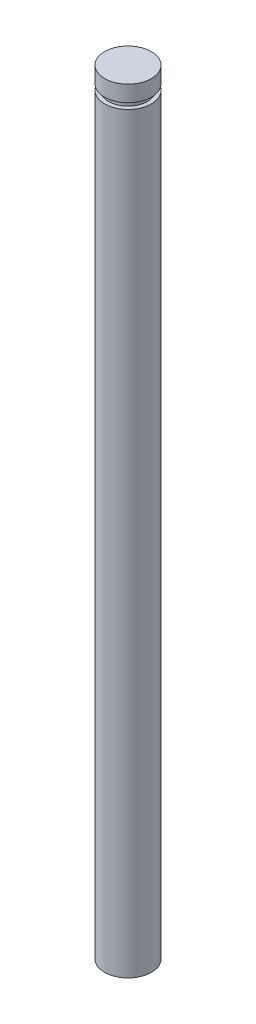
ISO-10303-21;
HEADER;
FILE_DESCRIPTION(('STEP AP214'),'2;1');
FILE_NAME('part.step','',(''),(''),'','','');
FILE_SCHEMA(('AUTOMOTIVE_DESIGN { 1 0 10303 214 1 1 1 1 }'));
ENDSEC;
DATA;
#1=APPLICATION_CONTEXT('core data for automotive mechanical design processes');
#2=APPLICATION_PROTOCOL_DEFINITION('international standard','automotive_design',2000,#1);
#3=PRODUCT_CONTEXT('',#1,'mechanical');
#4=PRODUCT('Part','Part','',(#3));
#5=PRODUCT_RELATED_PRODUCT_CATEGORY('part','',(#4));
#6=PRODUCT_DEFINITION_FORMATION('','',#4);
#7=PRODUCT_DEFINITION_CONTEXT('part definition',#1,'design');
#8=PRODUCT_DEFINITION('design','',#6,#7);
#9=PRODUCT_DEFINITION_SHAPE('','',#8);
#10=(LENGTH_UNIT() NAMED_UNIT(*) SI_UNIT(.MILLI.,.METRE.));
#11=(NAMED_UNIT(*) PLANE_ANGLE_UNIT() SI_UNIT($,.RADIAN.));
#12=(NAMED_UNIT(*) SI_UNIT($,.STERADIAN.) SOLID_ANGLE_UNIT());
#13=UNCERTAINTY_MEASURE_WITH_UNIT(LENGTH_MEASURE(1.E-05),#10,'distance_accuracy_value','');
#14=(GEOMETRIC_REPRESENTATION_CONTEXT(3) GLOBAL_UNCERTAINTY_ASSIGNED_CONTEXT((#13)) GLOBAL_UNIT_ASSIGNED_CONTEXT((#10,
#11,#12)) REPRESENTATION_CONTEXT('',''));
#15=CARTESIAN_POINT('',(0.,0.,0.));
#16=DIRECTION('',(0.,0.,1.));
#17=DIRECTION('',(1.,0.,0.));
#18=AXIS2_PLACEMENT_3D('',#15,#16,#17);
#19=CARTESIAN_POINT('',(0.,0.,0.));
#20=DIRECTION('',(0.,1.,0.));
#21=DIRECTION('',(-1.,0.,0.));
#22=AXIS2_PLACEMENT_3D('',#19,#20,#21);
#23=PLANE('',#22);
#24=CARTESIAN_POINT('',(0.,0.,0.));
#25=DIRECTION('',(0.,1.,0.));
#26=DIRECTION('',(-1.,0.,0.));
#27=AXIS2_PLACEMENT_3D('',#24,#25,#26);
#28=CIRCLE('',#27,0.725);
#29=CARTESIAN_POINT('',(-0.725,0.,0.));
#30=VERTEX_POINT('',#29);
#31=EDGE_CURVE('E10',#30,#30,#28,.T.);
#32=ORIENTED_EDGE('',*,*,#31,.F.);
#33=EDGE_LOOP('',(#32));
#34=FACE_BOUND('',#33,.T.);
#35=ADVANCED_FACE('F31',(#34),#23,.F.);
#36=CARTESIAN_POINT('',(0.,24.,0.));
#37=DIRECTION('',(0.,1.,0.));
#38=DIRECTION('',(-1.,0.,0.));
#39=AXIS2_PLACEMENT_3D('',#36,#37,#38);
#40=CYLINDRICAL_SURFACE('',#39,0.725000000000001);
#41=CARTESIAN_POINT('',(0.,23.32,0.));
#42=DIRECTION('',(0.,1.,0.));
#43=DIRECTION('',(-1.,0.,0.));
#44=AXIS2_PLACEMENT_3D('',#41,#42,#43);
#45=CIRCLE('',#44,0.725000000000002);
#46=CARTESIAN_POINT('',(-0.725000000000005,23.32,0.));
#47=VERTEX_POINT('',#46);
#48=EDGE_CURVE('E37',#47,#47,#45,.T.);
#49=ORIENTED_EDGE('',*,*,#48,.F.);
#50=EDGE_LOOP('',(#49));
#51=FACE_BOUND('',#50,.T.);
#52=ORIENTED_EDGE('',*,*,#31,.T.);
#53=EDGE_LOOP('',(#52));
#54=FACE_BOUND('',#53,.T.);
#55=ADVANCED_FACE('F79',(#51,#54),#40,.T.);
#56=CARTESIAN_POINT('',(0.725,23.32,0.));
#57=DIRECTION('',(0.,-1.,0.));
#58=DIRECTION('',(1.,0.,0.));
#59=AXIS2_PLACEMENT_3D('',#56,#57,#58);
#60=PLANE('',#59);
#61=CARTESIAN_POINT('',(0.,23.32,0.));
#62=DIRECTION('',(0.,1.,0.));
#63=DIRECTION('',(-1.,0.,0.));
#64=AXIS2_PLACEMENT_3D('',#61,#62,#63);
#65=CIRCLE('',#64,0.600000000000002);
#66=CARTESIAN_POINT('',(-0.600000000000005,23.32,0.));
#67=VERTEX_POINT('',#66);
#68=EDGE_CURVE('E41',#67,#67,#65,.T.);
#69=ORIENTED_EDGE('',*,*,#68,.F.);
#70=EDGE_LOOP('',(#69));
#71=FACE_BOUND('',#70,.T.);
#72=ORIENTED_EDGE('',*,*,#48,.T.);
#73=EDGE_LOOP('',(#72));
#74=FACE_BOUND('',#73,.T.);
#75=ADVANCED_FACE('F74',(#71,#74),#60,.F.);
#76=CARTESIAN_POINT('',(0.,24.,0.));
#77=DIRECTION('',(0.,1.,0.));
#78=DIRECTION('',(-1.,0.,0.));
#79=AXIS2_PLACEMENT_3D('',#76,#77,#78);
#80=CYLINDRICAL_SURFACE('',#79,0.600000000000002);
#81=CARTESIAN_POINT('',(0.,23.5,0.));
#82=DIRECTION('',(0.,1.,0.));
#83=DIRECTION('',(-1.,0.,0.));
#84=AXIS2_PLACEMENT_3D('',#81,#82,#83);
#85=CIRCLE('',#84,0.600000000000002);
#86=CARTESIAN_POINT('',(-0.600000000000005,23.5,0.));
#87=VERTEX_POINT('',#86);
#88=EDGE_CURVE('E45',#87,#87,#85,.T.);
#89=ORIENTED_EDGE('',*,*,#88,.F.);
#90=EDGE_LOOP('',(#89));
#91=FACE_BOUND('',#90,.T.);
#92=ORIENTED_EDGE('',*,*,#68,.T.);
#93=EDGE_LOOP('',(#92));
#94=FACE_BOUND('',#93,.T.);
#95=ADVANCED_FACE('F68',(#91,#94),#80,.T.);
#96=CARTESIAN_POINT('',(0.6,23.5,0.));
#97=DIRECTION('',(0.,1.,0.));
#98=DIRECTION('',(-1.,0.,0.));
#99=AXIS2_PLACEMENT_3D('',#96,#97,#98);
#100=PLANE('',#99);
#101=CARTESIAN_POINT('',(0.,23.5,0.));
#102=DIRECTION('',(0.,1.,0.));
#103=DIRECTION('',(-1.,0.,0.));
#104=AXIS2_PLACEMENT_3D('',#101,#102,#103);
#105=CIRCLE('',#104,0.725000000000002);
#106=CARTESIAN_POINT('',(-0.725000000000005,23.5,0.));
#107=VERTEX_POINT('',#106);
#108=EDGE_CURVE('E50',#107,#107,#105,.T.);
#109=ORIENTED_EDGE('',*,*,#108,.F.);
#110=EDGE_LOOP('',(#109));
#111=FACE_BOUND('',#110,.T.);
#112=ORIENTED_EDGE('',*,*,#88,.T.);
#113=EDGE_LOOP('',(#112));
#114=FACE_BOUND('',#113,.T.);
#115=ADVANCED_FACE('F62',(#111,#114),#100,.F.);
#116=CARTESIAN_POINT('',(0.,24.,0.));
#117=DIRECTION('',(0.,1.,0.));
#118=DIRECTION('',(-1.,0.,0.));
#119=AXIS2_PLACEMENT_3D('',#116,#117,#118);
#120=CYLINDRICAL_SURFACE('',#119,0.725000000000002);
#121=CARTESIAN_POINT('',(0.,24.,0.));
#122=DIRECTION('',(0.,1.,0.));
#123=DIRECTION('',(-1.,0.,0.));
#124=AXIS2_PLACEMENT_3D('',#121,#122,#123);
#125=CIRCLE('',#124,0.725000000000002);
#126=CARTESIAN_POINT('',(-0.725000000000005,24.,0.));
#127=VERTEX_POINT('',#126);
#128=EDGE_CURVE('E53',#127,#127,#125,.T.);
#129=ORIENTED_EDGE('',*,*,#128,.F.);
#130=EDGE_LOOP('',(#129));
#131=FACE_BOUND('',#130,.T.);
#132=ORIENTED_EDGE('',*,*,#108,.T.);
#133=EDGE_LOOP('',(#132));
#134=FACE_BOUND('',#133,.T.);
#135=ADVANCED_FACE('F59',(#131,#134),#120,.T.);
#136=CARTESIAN_POINT('',(0.725,24.,0.));
#137=DIRECTION('',(0.,-1.,0.));
#138=DIRECTION('',(1.,0.,0.));
#139=AXIS2_PLACEMENT_3D('',#136,#137,#138);
#140=PLANE('',#139);
#141=ORIENTED_EDGE('',*,*,#128,.T.);
#142=EDGE_LOOP('',(#141));
#143=FACE_BOUND('',#142,.T.);
#144=ADVANCED_FACE('F57',(#143),#140,.F.);
#145=CLOSED_SHELL('',(#35,#55,#75,#95,#115,#135,#144));
#146=MANIFOLD_SOLID_BREP('B2',#145);
#147=ADVANCED_BREP_SHAPE_REPRESENTATION('',(#18,#146),#14);
#148=SHAPE_DEFINITION_REPRESENTATION(#9,#147);
ENDSEC;
END-ISO-10303-21;
